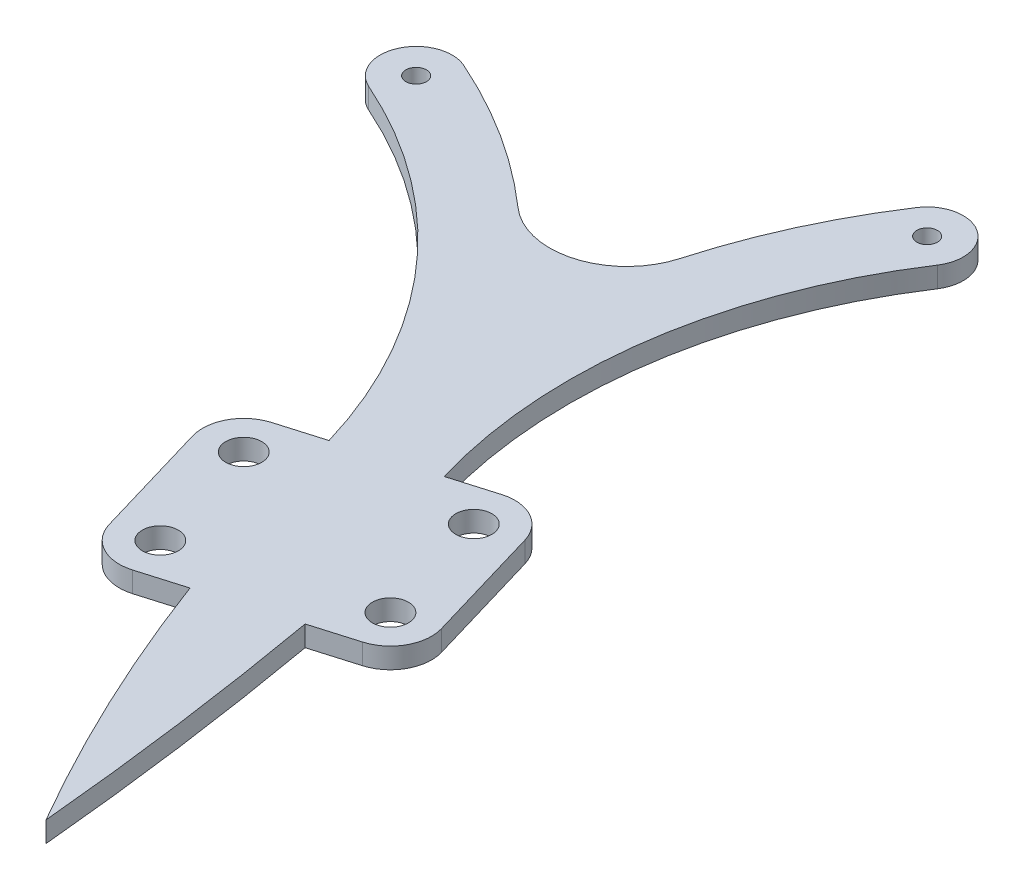
ISO-10303-21;
HEADER;
FILE_DESCRIPTION(('STEP AP214'),'2;1');
FILE_NAME('part.step','',(''),(''),'','','');
FILE_SCHEMA(('AUTOMOTIVE_DESIGN { 1 0 10303 214 1 1 1 1 }'));
ENDSEC;
DATA;
#1=APPLICATION_CONTEXT('core data for automotive mechanical design processes');
#2=APPLICATION_PROTOCOL_DEFINITION('international standard','automotive_design',2000,#1);
#3=PRODUCT_CONTEXT('',#1,'mechanical');
#4=PRODUCT('Part','Part','',(#3));
#5=PRODUCT_RELATED_PRODUCT_CATEGORY('part','',(#4));
#6=PRODUCT_DEFINITION_FORMATION('','',#4);
#7=PRODUCT_DEFINITION_CONTEXT('part definition',#1,'design');
#8=PRODUCT_DEFINITION('design','',#6,#7);
#9=PRODUCT_DEFINITION_SHAPE('','',#8);
#10=(LENGTH_UNIT() NAMED_UNIT(*) SI_UNIT(.MILLI.,.METRE.));
#11=(NAMED_UNIT(*) PLANE_ANGLE_UNIT() SI_UNIT($,.RADIAN.));
#12=(NAMED_UNIT(*) SI_UNIT($,.STERADIAN.) SOLID_ANGLE_UNIT());
#13=UNCERTAINTY_MEASURE_WITH_UNIT(LENGTH_MEASURE(1.E-05),#10,'distance_accuracy_value','');
#14=(GEOMETRIC_REPRESENTATION_CONTEXT(3) GLOBAL_UNCERTAINTY_ASSIGNED_CONTEXT((#13)) GLOBAL_UNIT_ASSIGNED_CONTEXT((#10,
#11,#12)) REPRESENTATION_CONTEXT('',''));
#15=CARTESIAN_POINT('',(0.,0.,0.));
#16=DIRECTION('',(0.,0.,1.));
#17=DIRECTION('',(1.,0.,0.));
#18=AXIS2_PLACEMENT_3D('',#15,#16,#17);
#19=CARTESIAN_POINT('',(84.0501917514937,-1.99999999999998,-23.9933912726605));
#20=DIRECTION('',(0.,-1.,0.));
#21=DIRECTION('',(0.,0.,-1.));
#22=AXIS2_PLACEMENT_3D('',#19,#20,#21);
#23=PLANE('',#22);
#24=CARTESIAN_POINT('',(-73.687037195012,-1.99999999999998,-28.2727576932935));
#25=DIRECTION('',(0.,-1.,0.));
#26=DIRECTION('',(0.,0.,-1.));
#27=AXIS2_PLACEMENT_3D('',#24,#25,#26);
#28=CIRCLE('',#27,0.999999999999998);
#29=CARTESIAN_POINT('',(-73.687037195012,-1.99999999999998,-29.2727576932935));
#30=VERTEX_POINT('',#29);
#31=EDGE_CURVE('E391',#30,#30,#28,.T.);
#32=ORIENTED_EDGE('',*,*,#31,.F.);
#33=EDGE_LOOP('',(#32));
#34=FACE_BOUND('',#33,.T.);
#35=CARTESIAN_POINT('',(-85.3543928779336,-1.99999999999998,34.6276476220212));
#36=DIRECTION('',(0.,-1.,0.));
#37=DIRECTION('',(0.,0.,-1.));
#38=AXIS2_PLACEMENT_3D('',#35,#36,#37);
#39=CIRCLE('',#38,1.74999999999911);
#40=CARTESIAN_POINT('',(-85.3543928779336,-1.99999999999998,32.8776476220221));
#41=VERTEX_POINT('',#40);
#42=EDGE_CURVE('E403',#41,#41,#39,.T.);
#43=ORIENTED_EDGE('',*,*,#42,.F.);
#44=EDGE_LOOP('',(#43));
#45=FACE_BOUND('',#44,.T.);
#46=CARTESIAN_POINT('',(-71.495221732293,-1.99999999999998,18.0003008286735));
#47=DIRECTION('',(0.,-1.,0.));
#48=DIRECTION('',(0.,0.,-1.));
#49=AXIS2_PLACEMENT_3D('',#46,#47,#48);
#50=CIRCLE('',#49,1.74999999999935);
#51=CARTESIAN_POINT('',(-71.495221732293,-1.99999999999998,16.2503008286742));
#52=VERTEX_POINT('',#51);
#53=EDGE_CURVE('E200',#52,#52,#50,.T.);
#54=ORIENTED_EDGE('',*,*,#53,.F.);
#55=EDGE_LOOP('',(#54));
#56=FACE_BOUND('',#55,.T.);
#57=CARTESIAN_POINT('',(84.0501917514937,-1.99999999999998,-23.9933912726605));
#58=DIRECTION('',(0.,-1.,0.));
#59=DIRECTION('',(0.,0.,-1.));
#60=AXIS2_PLACEMENT_3D('',#57,#58,#59);
#61=CIRCLE('',#60,174.999999999999);
#62=CARTESIAN_POINT('',(-67.3820401834826,-1.99999999999998,63.7179485369166));
#63=VERTEX_POINT('',#62);
#64=CARTESIAN_POINT('',(-79.9059632292725,-1.99999999999998,37.1897701683991));
#65=VERTEX_POINT('',#64);
#66=EDGE_CURVE('E233',#63,#65,#61,.T.);
#67=ORIENTED_EDGE('',*,*,#66,.T.);
#68=DIRECTION('',(-0.959075144214479,0.,0.283151669163323));
#69=VECTOR('',#68,1.);
#70=CARTESIAN_POINT('',(-84.2217862012803,-1.99999999999998,38.463948198879));
#71=LINE('',#70,#69);
#72=CARTESIAN_POINT('',(-84.2217862012803,-1.99999999999998,38.463948198879));
#73=VERTEX_POINT('',#72);
#74=EDGE_CURVE('E126',#65,#73,#71,.T.);
#75=ORIENTED_EDGE('',*,*,#74,.T.);
#76=CARTESIAN_POINT('',(-85.3543928779336,-1.99999999999998,34.6276476220212));
#77=DIRECTION('',(0.,-1.,0.));
#78=DIRECTION('',(0.,0.,-1.));
#79=AXIS2_PLACEMENT_3D('',#76,#77,#78);
#80=CIRCLE('',#79,3.99999999999989);
#81=CARTESIAN_POINT('',(-89.1906934547914,-1.99999999999998,35.7602542986745));
#82=VERTEX_POINT('',#81);
#83=EDGE_CURVE('E281',#73,#82,#80,.T.);
#84=ORIENTED_EDGE('',*,*,#83,.T.);
#85=DIRECTION('',(-0.283151669163323,0.,-0.959075144214479));
#86=VECTOR('',#85,1.);
#87=CARTESIAN_POINT('',(-92.5885134847512,-1.99999999999998,24.2513525681007));
#88=LINE('',#87,#86);
#89=CARTESIAN_POINT('',(-92.5885134847512,-1.99999999999998,24.2513525681007));
#90=VERTEX_POINT('',#89);
#91=EDGE_CURVE('E300',#82,#90,#88,.T.);
#92=ORIENTED_EDGE('',*,*,#91,.T.);
#93=CARTESIAN_POINT('',(-88.7522129078933,-1.99999999999998,23.1187458914474));
#94=DIRECTION('',(0.,-1.,0.));
#95=DIRECTION('',(0.,0.,-1.));
#96=AXIS2_PLACEMENT_3D('',#93,#94,#95);
#97=CIRCLE('',#96,3.99999999999999);
#98=CARTESIAN_POINT('',(-89.8848195845466,-1.99999999999998,19.2824453145895));
#99=VERTEX_POINT('',#98);
#100=EDGE_CURVE('E297',#90,#99,#97,.T.);
#101=ORIENTED_EDGE('',*,*,#100,.T.);
#102=DIRECTION('',(0.959075144214479,0.,-0.283151669163323));
#103=VECTOR('',#102,1.);
#104=CARTESIAN_POINT('',(-89.8848195845466,-1.99999999999998,19.2824453145895));
#105=LINE('',#104,#103);
#106=CARTESIAN_POINT('',(-85.5689966125389,-1.99999999999998,18.0082672841097));
#107=VERTEX_POINT('',#106);
#108=EDGE_CURVE('E299',#99,#107,#105,.T.);
#109=ORIENTED_EDGE('',*,*,#108,.T.);
#110=CARTESIAN_POINT('',(-133.797407264091,-1.99999999999998,32.2469377985729));
#111=DIRECTION('',(0.,1.,0.));
#112=DIRECTION('',(0.,0.,-1.));
#113=AXIS2_PLACEMENT_3D('',#110,#111,#112);
#114=CIRCLE('',#113,50.2863732237097);
#115=CARTESIAN_POINT('',(-113.46523465042,-1.99999999999998,-13.7456930111787));
#116=VERTEX_POINT('',#115);
#117=EDGE_CURVE('E302',#107,#116,#114,.T.);
#118=ORIENTED_EDGE('',*,*,#117,.T.);
#119=CARTESIAN_POINT('',(-112.050087770941,-1.99999999999998,-16.9468426967605));
#120=DIRECTION('',(0.,-1.,0.));
#121=DIRECTION('',(0.,0.,-1.));
#122=AXIS2_PLACEMENT_3D('',#119,#120,#121);
#123=CIRCLE('',#122,3.50000000000001);
#124=CARTESIAN_POINT('',(-110.634940891462,-1.99999999999998,-20.1479923823424));
#125=VERTEX_POINT('',#124);
#126=EDGE_CURVE('E308',#116,#125,#123,.T.);
#127=ORIENTED_EDGE('',*,*,#126,.T.);
#128=CARTESIAN_POINT('',(-133.797407264091,-1.99999999999998,32.2469377985729));
#129=DIRECTION('',(0.,-1.,0.));
#130=DIRECTION('',(0.,0.,-1.));
#131=AXIS2_PLACEMENT_3D('',#128,#129,#130);
#132=CIRCLE('',#131,57.2863732237097);
#133=CARTESIAN_POINT('',(-95.9967959370658,-1.99999999999998,-10.7977173914656));
#134=VERTEX_POINT('',#133);
#135=EDGE_CURVE('E310',#125,#134,#132,.T.);
#136=ORIENTED_EDGE('',*,*,#135,.T.);
#137=CARTESIAN_POINT('',(-91.047895020516,-1.99999999999998,-16.4331747569462));
#138=DIRECTION('',(0.,1.,0.));
#139=DIRECTION('',(0.,0.,-1.));
#140=AXIS2_PLACEMENT_3D('',#137,#138,#139);
#141=CIRCLE('',#140,7.49999999999849);
#142=CARTESIAN_POINT('',(-83.8319265586582,-1.99999999999998,-14.388719045161));
#143=VERTEX_POINT('',#142);
#144=EDGE_CURVE('E312',#134,#143,#141,.T.);
#145=ORIENTED_EDGE('',*,*,#144,.T.);
#146=CARTESIAN_POINT('',(-28.7626935602587,-1.99999999999998,1.21370612372912));
#147=DIRECTION('',(0.,-1.,0.));
#148=DIRECTION('',(0.,0.,-1.));
#149=AXIS2_PLACEMENT_3D('',#146,#147,#148);
#150=CIRCLE('',#149,57.2368421052632);
#151=CARTESIAN_POINT('',(-76.6130595767075,-1.99999999999998,-30.1932766392602));
#152=VERTEX_POINT('',#151);
#153=EDGE_CURVE('E314',#143,#152,#150,.T.);
#154=ORIENTED_EDGE('',*,*,#153,.T.);
#155=CARTESIAN_POINT('',(-73.687037195012,-1.99999999999998,-28.2727576932935));
#156=DIRECTION('',(0.,-1.,0.));
#157=DIRECTION('',(0.,0.,-1.));
#158=AXIS2_PLACEMENT_3D('',#155,#156,#157);
#159=CIRCLE('',#158,3.50000000000001);
#160=CARTESIAN_POINT('',(-70.7610148133165,-1.99999999999998,-26.3522387473268));
#161=VERTEX_POINT('',#160);
#162=EDGE_CURVE('E316',#152,#161,#159,.T.);
#163=ORIENTED_EDGE('',*,*,#162,.T.);
#164=CARTESIAN_POINT('',(-28.7626935602587,-1.99999999999998,1.21370612372912));
#165=DIRECTION('',(0.,1.,0.));
#166=DIRECTION('',(0.,0.,-1.));
#167=AXIS2_PLACEMENT_3D('',#164,#165,#166);
#168=CIRCLE('',#167,50.2368421052632);
#169=CARTESIAN_POINT('',(-76.9436564217383,-1.99999999999998,15.4381612081906));
#170=VERTEX_POINT('',#169);
#171=EDGE_CURVE('E318',#161,#170,#168,.T.);
#172=ORIENTED_EDGE('',*,*,#171,.T.);
#173=DIRECTION('',(0.959076264398232,0.,-0.283147874913324));
#174=VECTOR('',#173,1.);
#175=CARTESIAN_POINT('',(-72.6278132319459,-1.99999999999998,14.1639957710805));
#176=LINE('',#175,#174);
#177=CARTESIAN_POINT('',(-72.6278132319459,-1.99999999999998,14.1639957710805));
#178=VERTEX_POINT('',#177);
#179=EDGE_CURVE('E320',#170,#178,#176,.T.);
#180=ORIENTED_EDGE('',*,*,#179,.T.);
#181=CARTESIAN_POINT('',(-71.495221732293,-1.99999999999998,18.0003008286735));
#182=DIRECTION('',(0.,-1.,0.));
#183=DIRECTION('',(0.,0.,-1.));
#184=AXIS2_PLACEMENT_3D('',#181,#182,#183);
#185=CIRCLE('',#184,4.);
#186=CARTESIAN_POINT('',(-67.6589166747001,-1.99999999999998,16.8677093290202));
#187=VERTEX_POINT('',#186);
#188=EDGE_CURVE('E322',#178,#187,#185,.T.);
#189=ORIENTED_EDGE('',*,*,#188,.T.);
#190=DIRECTION('',(0.283147874913323,0.,0.959076264398233));
#191=VECTOR('',#190,1.);
#192=CARTESIAN_POINT('',(-64.2611421757402,-1.99999999999998,28.376624501799));
#193=LINE('',#192,#191);
#194=CARTESIAN_POINT('',(-64.2611421757401,-1.99999999999998,28.376624501799));
#195=VERTEX_POINT('',#194);
#196=EDGE_CURVE('E178',#187,#195,#193,.T.);
#197=ORIENTED_EDGE('',*,*,#196,.T.);
#198=CARTESIAN_POINT('',(-68.0974472333331,-1.99999999999998,29.5092160014523));
#199=DIRECTION('',(0.,-1.,0.));
#200=DIRECTION('',(0.,0.,-1.));
#201=AXIS2_PLACEMENT_3D('',#198,#199,#200);
#202=CIRCLE('',#201,4.00000000000002);
#203=CARTESIAN_POINT('',(-66.9648557336798,-1.99999999999998,33.3455210590453));
#204=VERTEX_POINT('',#203);
#205=EDGE_CURVE('E172',#195,#204,#202,.T.);
#206=ORIENTED_EDGE('',*,*,#205,.T.);
#207=DIRECTION('',(-0.959076264398232,0.,0.283147874913326));
#208=VECTOR('',#207,1.);
#209=CARTESIAN_POINT('',(-71.2806989234718,-1.99999999999998,34.6196864961552));
#210=LINE('',#209,#208);
#211=CARTESIAN_POINT('',(-71.2806989234717,-1.99999999999998,34.6196864961552));
#212=VERTEX_POINT('',#211);
#213=EDGE_CURVE('E176',#204,#212,#210,.T.);
#214=ORIENTED_EDGE('',*,*,#213,.T.);
#215=CARTESIAN_POINT('',(-415.926328807404,-1.99999999999998,95.606486722987));
#216=DIRECTION('',(0.,-1.,0.));
#217=DIRECTION('',(0.,0.,-1.));
#218=AXIS2_PLACEMENT_3D('',#215,#216,#217);
#219=CIRCLE('',#218,350.);
#220=EDGE_CURVE('E50',#212,#63,#219,.T.);
#221=ORIENTED_EDGE('',*,*,#220,.T.);
#222=EDGE_LOOP('',(#67,#75,#84,#92,#101,#109,#118,#127,#136,#145,#154,#163,#172,#180,#189,#197,
#206,#214,#221));
#223=FACE_BOUND('',#222,.T.);
#224=CARTESIAN_POINT('',(-68.0974472333331,-1.99999999999998,29.5092160014523));
#225=DIRECTION('',(0.,-1.,0.));
#226=DIRECTION('',(0.,0.,-1.));
#227=AXIS2_PLACEMENT_3D('',#224,#225,#226);
#228=CIRCLE('',#227,1.74999999999928);
#229=CARTESIAN_POINT('',(-68.0974472333331,-1.99999999999998,27.759216001453));
#230=VERTEX_POINT('',#229);
#231=EDGE_CURVE('E409',#230,#230,#228,.T.);
#232=ORIENTED_EDGE('',*,*,#231,.F.);
#233=EDGE_LOOP('',(#232));
#234=FACE_BOUND('',#233,.T.);
#235=CARTESIAN_POINT('',(-88.7522129078933,-1.99999999999998,23.1187458914474));
#236=DIRECTION('',(0.,-1.,0.));
#237=DIRECTION('',(0.,0.,-1.));
#238=AXIS2_PLACEMENT_3D('',#235,#236,#237);
#239=CIRCLE('',#238,1.74999999999804);
#240=CARTESIAN_POINT('',(-88.7522129078933,-1.99999999999998,21.3687458914494));
#241=VERTEX_POINT('',#240);
#242=EDGE_CURVE('E397',#241,#241,#239,.T.);
#243=ORIENTED_EDGE('',*,*,#242,.F.);
#244=EDGE_LOOP('',(#243));
#245=FACE_BOUND('',#244,.T.);
#246=CARTESIAN_POINT('',(-112.050087770941,-1.99999999999998,-16.9468426967605));
#247=DIRECTION('',(0.,-1.,0.));
#248=DIRECTION('',(0.,0.,-1.));
#249=AXIS2_PLACEMENT_3D('',#246,#247,#248);
#250=CIRCLE('',#249,0.999999999999998);
#251=CARTESIAN_POINT('',(-112.050087770941,-1.99999999999998,-17.9468426967605));
#252=VERTEX_POINT('',#251);
#253=EDGE_CURVE('E382',#252,#252,#250,.T.);
#254=ORIENTED_EDGE('',*,*,#253,.F.);
#255=EDGE_LOOP('',(#254));
#256=FACE_BOUND('',#255,.T.);
#257=ADVANCED_FACE('F33',(#34,#45,#56,#223,#234,#245,#256),#23,.T.);
#258=CARTESIAN_POINT('',(84.0501917514937,0.,-23.9933912726605));
#259=DIRECTION('',(0.,-1.,0.));
#260=DIRECTION('',(0.,0.,-1.));
#261=AXIS2_PLACEMENT_3D('',#258,#259,#260);
#262=PLANE('',#261);
#263=CARTESIAN_POINT('',(-73.687037195012,0.,-28.2727576932935));
#264=DIRECTION('',(0.,-1.,0.));
#265=DIRECTION('',(0.,0.,-1.));
#266=AXIS2_PLACEMENT_3D('',#263,#264,#265);
#267=CIRCLE('',#266,0.999999999999998);
#268=CARTESIAN_POINT('',(-73.687037195012,0.,-29.2727576932935));
#269=VERTEX_POINT('',#268);
#270=EDGE_CURVE('E388',#269,#269,#267,.T.);
#271=ORIENTED_EDGE('',*,*,#270,.T.);
#272=EDGE_LOOP('',(#271));
#273=FACE_BOUND('',#272,.T.);
#274=CARTESIAN_POINT('',(-85.3543928779336,0.,34.6276476220212));
#275=DIRECTION('',(0.,-1.,0.));
#276=DIRECTION('',(0.,0.,-1.));
#277=AXIS2_PLACEMENT_3D('',#274,#275,#276);
#278=CIRCLE('',#277,1.74999999999911);
#279=CARTESIAN_POINT('',(-85.3543928779336,0.,32.8776476220221));
#280=VERTEX_POINT('',#279);
#281=EDGE_CURVE('E400',#280,#280,#278,.T.);
#282=ORIENTED_EDGE('',*,*,#281,.T.);
#283=EDGE_LOOP('',(#282));
#284=FACE_BOUND('',#283,.T.);
#285=CARTESIAN_POINT('',(-71.495221732293,0.,18.0003008286735));
#286=DIRECTION('',(0.,-1.,0.));
#287=DIRECTION('',(0.,0.,-1.));
#288=AXIS2_PLACEMENT_3D('',#285,#286,#287);
#289=CIRCLE('',#288,1.74999999999935);
#290=CARTESIAN_POINT('',(-71.495221732293,0.,16.2503008286742));
#291=VERTEX_POINT('',#290);
#292=EDGE_CURVE('E412',#291,#291,#289,.T.);
#293=ORIENTED_EDGE('',*,*,#292,.T.);
#294=EDGE_LOOP('',(#293));
#295=FACE_BOUND('',#294,.T.);
#296=CARTESIAN_POINT('',(84.0501917514937,0.,-23.9933912726605));
#297=DIRECTION('',(0.,-1.,0.));
#298=DIRECTION('',(0.,0.,-1.));
#299=AXIS2_PLACEMENT_3D('',#296,#297,#298);
#300=CIRCLE('',#299,174.999999999999);
#301=CARTESIAN_POINT('',(-67.3820401834826,0.,63.7179485369166));
#302=VERTEX_POINT('',#301);
#303=CARTESIAN_POINT('',(-79.9059632292725,0.,37.1897701683991));
#304=VERTEX_POINT('',#303);
#305=EDGE_CURVE('E196',#302,#304,#300,.T.);
#306=ORIENTED_EDGE('',*,*,#305,.F.);
#307=CARTESIAN_POINT('',(-415.926328807404,0.,95.606486722987));
#308=DIRECTION('',(0.,-1.,0.));
#309=DIRECTION('',(0.,0.,-1.));
#310=AXIS2_PLACEMENT_3D('',#307,#308,#309);
#311=CIRCLE('',#310,350.);
#312=CARTESIAN_POINT('',(-71.2806989234717,0.,34.6196864961552));
#313=VERTEX_POINT('',#312);
#314=EDGE_CURVE('E118',#313,#302,#311,.T.);
#315=ORIENTED_EDGE('',*,*,#314,.F.);
#316=DIRECTION('',(-0.959076264398232,0.,0.283147874913326));
#317=VECTOR('',#316,1.);
#318=CARTESIAN_POINT('',(-71.2806989234718,0.,34.6196864961552));
#319=LINE('',#318,#317);
#320=CARTESIAN_POINT('',(-66.9648557336798,0.,33.3455210590453));
#321=VERTEX_POINT('',#320);
#322=EDGE_CURVE('E112',#321,#313,#319,.T.);
#323=ORIENTED_EDGE('',*,*,#322,.F.);
#324=CARTESIAN_POINT('',(-68.0974472333331,0.,29.5092160014523));
#325=DIRECTION('',(0.,-1.,0.));
#326=DIRECTION('',(0.,0.,-1.));
#327=AXIS2_PLACEMENT_3D('',#324,#325,#326);
#328=CIRCLE('',#327,4.00000000000002);
#329=CARTESIAN_POINT('',(-64.2611421757401,0.,28.376624501799));
#330=VERTEX_POINT('',#329);
#331=EDGE_CURVE('E186',#330,#321,#328,.T.);
#332=ORIENTED_EDGE('',*,*,#331,.F.);
#333=DIRECTION('',(0.283147874913323,0.,0.959076264398233));
#334=VECTOR('',#333,1.);
#335=CARTESIAN_POINT('',(-64.2611421757402,0.,28.376624501799));
#336=LINE('',#335,#334);
#337=CARTESIAN_POINT('',(-67.6589166747001,0.,16.8677093290202));
#338=VERTEX_POINT('',#337);
#339=EDGE_CURVE('E228',#338,#330,#336,.T.);
#340=ORIENTED_EDGE('',*,*,#339,.F.);
#341=CARTESIAN_POINT('',(-71.495221732293,0.,18.0003008286735));
#342=DIRECTION('',(0.,-1.,0.));
#343=DIRECTION('',(0.,0.,-1.));
#344=AXIS2_PLACEMENT_3D('',#341,#342,#343);
#345=CIRCLE('',#344,4.);
#346=CARTESIAN_POINT('',(-72.6278132319459,0.,14.1639957710805));
#347=VERTEX_POINT('',#346);
#348=EDGE_CURVE('E226',#347,#338,#345,.T.);
#349=ORIENTED_EDGE('',*,*,#348,.F.);
#350=DIRECTION('',(0.959076264398232,0.,-0.283147874913324));
#351=VECTOR('',#350,1.);
#352=CARTESIAN_POINT('',(-72.6278132319459,0.,14.1639957710805));
#353=LINE('',#352,#351);
#354=CARTESIAN_POINT('',(-76.9436564217383,0.,15.4381612081906));
#355=VERTEX_POINT('',#354);
#356=EDGE_CURVE('E224',#355,#347,#353,.T.);
#357=ORIENTED_EDGE('',*,*,#356,.F.);
#358=CARTESIAN_POINT('',(-28.7626935602587,0.,1.21370612372912));
#359=DIRECTION('',(0.,1.,0.));
#360=DIRECTION('',(0.,0.,-1.));
#361=AXIS2_PLACEMENT_3D('',#358,#359,#360);
#362=CIRCLE('',#361,50.2368421052632);
#363=CARTESIAN_POINT('',(-70.7610148133165,0.,-26.3522387473268));
#364=VERTEX_POINT('',#363);
#365=EDGE_CURVE('E222',#364,#355,#362,.T.);
#366=ORIENTED_EDGE('',*,*,#365,.F.);
#367=CARTESIAN_POINT('',(-73.687037195012,0.,-28.2727576932935));
#368=DIRECTION('',(0.,-1.,0.));
#369=DIRECTION('',(0.,0.,-1.));
#370=AXIS2_PLACEMENT_3D('',#367,#368,#369);
#371=CIRCLE('',#370,3.50000000000001);
#372=CARTESIAN_POINT('',(-76.6130595767075,0.,-30.1932766392602));
#373=VERTEX_POINT('',#372);
#374=EDGE_CURVE('E220',#373,#364,#371,.T.);
#375=ORIENTED_EDGE('',*,*,#374,.F.);
#376=CARTESIAN_POINT('',(-28.7626935602587,0.,1.21370612372912));
#377=DIRECTION('',(0.,-1.,0.));
#378=DIRECTION('',(0.,0.,-1.));
#379=AXIS2_PLACEMENT_3D('',#376,#377,#378);
#380=CIRCLE('',#379,57.2368421052632);
#381=CARTESIAN_POINT('',(-83.8319265586582,0.,-14.388719045161));
#382=VERTEX_POINT('',#381);
#383=EDGE_CURVE('E218',#382,#373,#380,.T.);
#384=ORIENTED_EDGE('',*,*,#383,.F.);
#385=CARTESIAN_POINT('',(-91.047895020516,0.,-16.4331747569462));
#386=DIRECTION('',(0.,1.,0.));
#387=DIRECTION('',(0.,0.,-1.));
#388=AXIS2_PLACEMENT_3D('',#385,#386,#387);
#389=CIRCLE('',#388,7.49999999999849);
#390=CARTESIAN_POINT('',(-95.9967959370658,0.,-10.7977173914656));
#391=VERTEX_POINT('',#390);
#392=EDGE_CURVE('E216',#391,#382,#389,.T.);
#393=ORIENTED_EDGE('',*,*,#392,.F.);
#394=CARTESIAN_POINT('',(-133.797407264091,0.,32.2469377985729));
#395=DIRECTION('',(0.,-1.,0.));
#396=DIRECTION('',(0.,0.,-1.));
#397=AXIS2_PLACEMENT_3D('',#394,#395,#396);
#398=CIRCLE('',#397,57.2863732237097);
#399=CARTESIAN_POINT('',(-110.634940891462,0.,-20.1479923823424));
#400=VERTEX_POINT('',#399);
#401=EDGE_CURVE('E214',#400,#391,#398,.T.);
#402=ORIENTED_EDGE('',*,*,#401,.F.);
#403=CARTESIAN_POINT('',(-112.050087770941,0.,-16.9468426967605));
#404=DIRECTION('',(0.,-1.,0.));
#405=DIRECTION('',(0.,0.,-1.));
#406=AXIS2_PLACEMENT_3D('',#403,#404,#405);
#407=CIRCLE('',#406,3.50000000000001);
#408=CARTESIAN_POINT('',(-113.46523465042,0.,-13.7456930111787));
#409=VERTEX_POINT('',#408);
#410=EDGE_CURVE('E212',#409,#400,#407,.T.);
#411=ORIENTED_EDGE('',*,*,#410,.F.);
#412=CARTESIAN_POINT('',(-133.797407264091,0.,32.2469377985729));
#413=DIRECTION('',(0.,1.,0.));
#414=DIRECTION('',(0.,0.,-1.));
#415=AXIS2_PLACEMENT_3D('',#412,#413,#414);
#416=CIRCLE('',#415,50.2863732237097);
#417=CARTESIAN_POINT('',(-85.5689966125389,0.,18.0082672841097));
#418=VERTEX_POINT('',#417);
#419=EDGE_CURVE('E210',#418,#409,#416,.T.);
#420=ORIENTED_EDGE('',*,*,#419,.F.);
#421=DIRECTION('',(0.959075144214479,0.,-0.283151669163323));
#422=VECTOR('',#421,1.);
#423=CARTESIAN_POINT('',(-89.8848195845466,0.,19.2824453145895));
#424=LINE('',#423,#422);
#425=CARTESIAN_POINT('',(-89.8848195845466,0.,19.2824453145895));
#426=VERTEX_POINT('',#425);
#427=EDGE_CURVE('E208',#426,#418,#424,.T.);
#428=ORIENTED_EDGE('',*,*,#427,.F.);
#429=CARTESIAN_POINT('',(-88.7522129078933,0.,23.1187458914474));
#430=DIRECTION('',(0.,-1.,0.));
#431=DIRECTION('',(0.,0.,-1.));
#432=AXIS2_PLACEMENT_3D('',#429,#430,#431);
#433=CIRCLE('',#432,3.99999999999999);
#434=CARTESIAN_POINT('',(-92.5885134847512,0.,24.2513525681007));
#435=VERTEX_POINT('',#434);
#436=EDGE_CURVE('E206',#435,#426,#433,.T.);
#437=ORIENTED_EDGE('',*,*,#436,.F.);
#438=DIRECTION('',(-0.283151669163323,0.,-0.959075144214479));
#439=VECTOR('',#438,1.);
#440=CARTESIAN_POINT('',(-92.5885134847512,0.,24.2513525681007));
#441=LINE('',#440,#439);
#442=CARTESIAN_POINT('',(-89.1906934547914,0.,35.7602542986745));
#443=VERTEX_POINT('',#442);
#444=EDGE_CURVE('E204',#443,#435,#441,.T.);
#445=ORIENTED_EDGE('',*,*,#444,.F.);
#446=CARTESIAN_POINT('',(-85.3543928779336,0.,34.6276476220212));
#447=DIRECTION('',(0.,-1.,0.));
#448=DIRECTION('',(0.,0.,-1.));
#449=AXIS2_PLACEMENT_3D('',#446,#447,#448);
#450=CIRCLE('',#449,3.99999999999989);
#451=CARTESIAN_POINT('',(-84.2217862012803,0.,38.463948198879));
#452=VERTEX_POINT('',#451);
#453=EDGE_CURVE('E202',#452,#443,#450,.T.);
#454=ORIENTED_EDGE('',*,*,#453,.F.);
#455=DIRECTION('',(-0.959075144214479,0.,0.283151669163323));
#456=VECTOR('',#455,1.);
#457=CARTESIAN_POINT('',(-84.2217862012803,0.,38.463948198879));
#458=LINE('',#457,#456);
#459=EDGE_CURVE('E199',#304,#452,#458,.T.);
#460=ORIENTED_EDGE('',*,*,#459,.F.);
#461=EDGE_LOOP('',(#306,#315,#323,#332,#340,#349,#357,#366,#375,#384,#393,#402,#411,#420,#428,
#437,#445,#454,#460));
#462=FACE_BOUND('',#461,.T.);
#463=CARTESIAN_POINT('',(-68.0974472333331,0.,29.5092160014523));
#464=DIRECTION('',(0.,-1.,0.));
#465=DIRECTION('',(0.,0.,-1.));
#466=AXIS2_PLACEMENT_3D('',#463,#464,#465);
#467=CIRCLE('',#466,1.74999999999928);
#468=CARTESIAN_POINT('',(-68.0974472333331,0.,27.759216001453));
#469=VERTEX_POINT('',#468);
#470=EDGE_CURVE('E406',#469,#469,#467,.T.);
#471=ORIENTED_EDGE('',*,*,#470,.T.);
#472=EDGE_LOOP('',(#471));
#473=FACE_BOUND('',#472,.T.);
#474=CARTESIAN_POINT('',(-88.7522129078933,0.,23.1187458914474));
#475=DIRECTION('',(0.,-1.,0.));
#476=DIRECTION('',(0.,0.,-1.));
#477=AXIS2_PLACEMENT_3D('',#474,#475,#476);
#478=CIRCLE('',#477,1.74999999999804);
#479=CARTESIAN_POINT('',(-88.7522129078933,0.,21.3687458914494));
#480=VERTEX_POINT('',#479);
#481=EDGE_CURVE('E394',#480,#480,#478,.T.);
#482=ORIENTED_EDGE('',*,*,#481,.T.);
#483=EDGE_LOOP('',(#482));
#484=FACE_BOUND('',#483,.T.);
#485=CARTESIAN_POINT('',(-112.050087770941,0.,-16.9468426967605));
#486=DIRECTION('',(0.,-1.,0.));
#487=DIRECTION('',(0.,0.,-1.));
#488=AXIS2_PLACEMENT_3D('',#485,#486,#487);
#489=CIRCLE('',#488,0.999999999999998);
#490=CARTESIAN_POINT('',(-112.050087770941,0.,-17.9468426967605));
#491=VERTEX_POINT('',#490);
#492=EDGE_CURVE('E385',#491,#491,#489,.T.);
#493=ORIENTED_EDGE('',*,*,#492,.T.);
#494=EDGE_LOOP('',(#493));
#495=FACE_BOUND('',#494,.T.);
#496=ADVANCED_FACE('F285',(#273,#284,#295,#462,#473,#484,#495),#262,.F.);
#497=CARTESIAN_POINT('',(84.0501917514937,-1.99999999999998,-23.9933912726605));
#498=DIRECTION('',(0.,1.,0.));
#499=DIRECTION('',(0.,0.,1.));
#500=AXIS2_PLACEMENT_3D('',#497,#498,#499);
#501=CYLINDRICAL_SURFACE('',#500,174.999999999999);
#502=ORIENTED_EDGE('',*,*,#305,.T.);
#503=DIRECTION('',(0.,1.,0.));
#504=VECTOR('',#503,1.);
#505=CARTESIAN_POINT('',(-79.9059632292725,-1.99999999999998,37.1897701683991));
#506=LINE('',#505,#504);
#507=EDGE_CURVE('E11',#65,#304,#506,.T.);
#508=ORIENTED_EDGE('',*,*,#507,.F.);
#509=ORIENTED_EDGE('',*,*,#66,.F.);
#510=DIRECTION('',(0.,1.,0.));
#511=VECTOR('',#510,1.);
#512=CARTESIAN_POINT('',(-67.3820401834826,-1.99999999999998,63.7179485369166));
#513=LINE('',#512,#511);
#514=EDGE_CURVE('E192',#63,#302,#513,.T.);
#515=ORIENTED_EDGE('',*,*,#514,.T.);
#516=EDGE_LOOP('',(#502,#508,#509,#515));
#517=FACE_BOUND('',#516,.T.);
#518=ADVANCED_FACE('F35',(#517),#501,.T.);
#519=CARTESIAN_POINT('',(-84.2217862012803,-1.99999999999998,38.463948198879));
#520=DIRECTION('',(-0.283151669163323,0.,-0.959075144214479));
#521=DIRECTION('',(-0.959075144214479,0.,0.283151669163323));
#522=AXIS2_PLACEMENT_3D('',#519,#520,#521);
#523=PLANE('',#522);
#524=ORIENTED_EDGE('',*,*,#459,.T.);
#525=DIRECTION('',(0.,1.,0.));
#526=VECTOR('',#525,1.);
#527=CARTESIAN_POINT('',(-84.2217862012803,-1.99999999999998,38.463948198879));
#528=LINE('',#527,#526);
#529=EDGE_CURVE('E42',#73,#452,#528,.T.);
#530=ORIENTED_EDGE('',*,*,#529,.F.);
#531=ORIENTED_EDGE('',*,*,#74,.F.);
#532=ORIENTED_EDGE('',*,*,#507,.T.);
#533=EDGE_LOOP('',(#524,#530,#531,#532));
#534=FACE_BOUND('',#533,.T.);
#535=ADVANCED_FACE('F609',(#534),#523,.F.);
#536=CARTESIAN_POINT('',(-85.3543928779336,-1.99999999999998,34.6276476220212));
#537=DIRECTION('',(0.,1.,0.));
#538=DIRECTION('',(0.,0.,1.));
#539=AXIS2_PLACEMENT_3D('',#536,#537,#538);
#540=CYLINDRICAL_SURFACE('',#539,3.99999999999989);
#541=ORIENTED_EDGE('',*,*,#453,.T.);
#542=DIRECTION('',(0.,1.,0.));
#543=VECTOR('',#542,1.);
#544=CARTESIAN_POINT('',(-89.1906934547914,-1.99999999999998,35.7602542986745));
#545=LINE('',#544,#543);
#546=EDGE_CURVE('E273',#82,#443,#545,.T.);
#547=ORIENTED_EDGE('',*,*,#546,.F.);
#548=ORIENTED_EDGE('',*,*,#83,.F.);
#549=ORIENTED_EDGE('',*,*,#529,.T.);
#550=EDGE_LOOP('',(#541,#547,#548,#549));
#551=FACE_BOUND('',#550,.T.);
#552=ADVANCED_FACE('F279',(#551),#540,.T.);
#553=CARTESIAN_POINT('',(-92.5885134847512,-1.99999999999998,24.2513525681007));
#554=DIRECTION('',(0.959075144214479,0.,-0.283151669163323));
#555=DIRECTION('',(-0.283151669163323,0.,-0.959075144214479));
#556=AXIS2_PLACEMENT_3D('',#553,#554,#555);
#557=PLANE('',#556);
#558=ORIENTED_EDGE('',*,*,#444,.T.);
#559=DIRECTION('',(0.,1.,0.));
#560=VECTOR('',#559,1.);
#561=CARTESIAN_POINT('',(-92.5885134847512,-1.99999999999998,24.2513525681007));
#562=LINE('',#561,#560);
#563=EDGE_CURVE('E270',#90,#435,#562,.T.);
#564=ORIENTED_EDGE('',*,*,#563,.F.);
#565=ORIENTED_EDGE('',*,*,#91,.F.);
#566=ORIENTED_EDGE('',*,*,#546,.T.);
#567=EDGE_LOOP('',(#558,#564,#565,#566));
#568=FACE_BOUND('',#567,.T.);
#569=ADVANCED_FACE('F291',(#568),#557,.F.);
#570=CARTESIAN_POINT('',(-88.7522129078933,-1.99999999999998,23.1187458914474));
#571=DIRECTION('',(0.,1.,0.));
#572=DIRECTION('',(0.,0.,1.));
#573=AXIS2_PLACEMENT_3D('',#570,#571,#572);
#574=CYLINDRICAL_SURFACE('',#573,3.99999999999999);
#575=ORIENTED_EDGE('',*,*,#436,.T.);
#576=DIRECTION('',(0.,1.,0.));
#577=VECTOR('',#576,1.);
#578=CARTESIAN_POINT('',(-89.8848195845466,-1.99999999999998,19.2824453145895));
#579=LINE('',#578,#577);
#580=EDGE_CURVE('E267',#99,#426,#579,.T.);
#581=ORIENTED_EDGE('',*,*,#580,.F.);
#582=ORIENTED_EDGE('',*,*,#100,.F.);
#583=ORIENTED_EDGE('',*,*,#563,.T.);
#584=EDGE_LOOP('',(#575,#581,#582,#583));
#585=FACE_BOUND('',#584,.T.);
#586=ADVANCED_FACE('F295',(#585),#574,.T.);
#587=CARTESIAN_POINT('',(-89.8848195845466,-1.99999999999998,19.2824453145895));
#588=DIRECTION('',(0.283151669163323,0.,0.959075144214479));
#589=DIRECTION('',(0.959075144214479,0.,-0.283151669163323));
#590=AXIS2_PLACEMENT_3D('',#587,#588,#589);
#591=PLANE('',#590);
#592=ORIENTED_EDGE('',*,*,#427,.T.);
#593=DIRECTION('',(0.,1.,0.));
#594=VECTOR('',#593,1.);
#595=CARTESIAN_POINT('',(-85.5689966125389,-1.99999999999998,18.0082672841097));
#596=LINE('',#595,#594);
#597=EDGE_CURVE('E264',#107,#418,#596,.T.);
#598=ORIENTED_EDGE('',*,*,#597,.F.);
#599=ORIENTED_EDGE('',*,*,#108,.F.);
#600=ORIENTED_EDGE('',*,*,#580,.T.);
#601=EDGE_LOOP('',(#592,#598,#599,#600));
#602=FACE_BOUND('',#601,.T.);
#603=ADVANCED_FACE('F574',(#602),#591,.F.);
#604=CARTESIAN_POINT('',(-133.797407264091,-1.99999999999998,32.2469377985729));
#605=DIRECTION('',(0.,1.,0.));
#606=DIRECTION('',(0.,0.,1.));
#607=AXIS2_PLACEMENT_3D('',#604,#605,#606);
#608=CYLINDRICAL_SURFACE('',#607,50.2863732237097);
#609=ORIENTED_EDGE('',*,*,#419,.T.);
#610=DIRECTION('',(0.,1.,0.));
#611=VECTOR('',#610,1.);
#612=CARTESIAN_POINT('',(-113.46523465042,-1.99999999999998,-13.7456930111787));
#613=LINE('',#612,#611);
#614=EDGE_CURVE('E261',#116,#409,#613,.T.);
#615=ORIENTED_EDGE('',*,*,#614,.F.);
#616=ORIENTED_EDGE('',*,*,#117,.F.);
#617=ORIENTED_EDGE('',*,*,#597,.T.);
#618=EDGE_LOOP('',(#609,#615,#616,#617));
#619=FACE_BOUND('',#618,.T.);
#620=ADVANCED_FACE('F564',(#619),#608,.F.);
#621=CARTESIAN_POINT('',(-112.050087770941,-1.99999999999998,-16.9468426967605));
#622=DIRECTION('',(0.,1.,0.));
#623=DIRECTION('',(0.,0.,1.));
#624=AXIS2_PLACEMENT_3D('',#621,#622,#623);
#625=CYLINDRICAL_SURFACE('',#624,3.50000000000001);
#626=ORIENTED_EDGE('',*,*,#410,.T.);
#627=DIRECTION('',(0.,1.,0.));
#628=VECTOR('',#627,1.);
#629=CARTESIAN_POINT('',(-110.634940891462,-1.99999999999998,-20.1479923823424));
#630=LINE('',#629,#628);
#631=EDGE_CURVE('E258',#125,#400,#630,.T.);
#632=ORIENTED_EDGE('',*,*,#631,.F.);
#633=ORIENTED_EDGE('',*,*,#126,.F.);
#634=ORIENTED_EDGE('',*,*,#614,.T.);
#635=EDGE_LOOP('',(#626,#632,#633,#634));
#636=FACE_BOUND('',#635,.T.);
#637=ADVANCED_FACE('F554',(#636),#625,.T.);
#638=CARTESIAN_POINT('',(-133.797407264091,-1.99999999999998,32.2469377985729));
#639=DIRECTION('',(0.,1.,0.));
#640=DIRECTION('',(0.,0.,1.));
#641=AXIS2_PLACEMENT_3D('',#638,#639,#640);
#642=CYLINDRICAL_SURFACE('',#641,57.2863732237097);
#643=ORIENTED_EDGE('',*,*,#401,.T.);
#644=DIRECTION('',(0.,1.,0.));
#645=VECTOR('',#644,1.);
#646=CARTESIAN_POINT('',(-95.9967959370658,-1.99999999999998,-10.7977173914656));
#647=LINE('',#646,#645);
#648=EDGE_CURVE('E255',#134,#391,#647,.T.);
#649=ORIENTED_EDGE('',*,*,#648,.F.);
#650=ORIENTED_EDGE('',*,*,#135,.F.);
#651=ORIENTED_EDGE('',*,*,#631,.T.);
#652=EDGE_LOOP('',(#643,#649,#650,#651));
#653=FACE_BOUND('',#652,.T.);
#654=ADVANCED_FACE('F544',(#653),#642,.T.);
#655=CARTESIAN_POINT('',(-91.047895020516,-1.99999999999998,-16.4331747569462));
#656=DIRECTION('',(0.,1.,0.));
#657=DIRECTION('',(0.,0.,1.));
#658=AXIS2_PLACEMENT_3D('',#655,#656,#657);
#659=CYLINDRICAL_SURFACE('',#658,7.49999999999849);
#660=ORIENTED_EDGE('',*,*,#392,.T.);
#661=DIRECTION('',(0.,1.,0.));
#662=VECTOR('',#661,1.);
#663=CARTESIAN_POINT('',(-83.8319265586582,-1.99999999999998,-14.388719045161));
#664=LINE('',#663,#662);
#665=EDGE_CURVE('E252',#143,#382,#664,.T.);
#666=ORIENTED_EDGE('',*,*,#665,.F.);
#667=ORIENTED_EDGE('',*,*,#144,.F.);
#668=ORIENTED_EDGE('',*,*,#648,.T.);
#669=EDGE_LOOP('',(#660,#666,#667,#668));
#670=FACE_BOUND('',#669,.T.);
#671=ADVANCED_FACE('F534',(#670),#659,.F.);
#672=CARTESIAN_POINT('',(-28.7626935602587,-1.99999999999998,1.21370612372912));
#673=DIRECTION('',(0.,1.,0.));
#674=DIRECTION('',(0.,0.,1.));
#675=AXIS2_PLACEMENT_3D('',#672,#673,#674);
#676=CYLINDRICAL_SURFACE('',#675,57.2368421052632);
#677=ORIENTED_EDGE('',*,*,#383,.T.);
#678=DIRECTION('',(0.,1.,0.));
#679=VECTOR('',#678,1.);
#680=CARTESIAN_POINT('',(-76.6130595767075,-1.99999999999998,-30.1932766392602));
#681=LINE('',#680,#679);
#682=EDGE_CURVE('E249',#152,#373,#681,.T.);
#683=ORIENTED_EDGE('',*,*,#682,.F.);
#684=ORIENTED_EDGE('',*,*,#153,.F.);
#685=ORIENTED_EDGE('',*,*,#665,.T.);
#686=EDGE_LOOP('',(#677,#683,#684,#685));
#687=FACE_BOUND('',#686,.T.);
#688=ADVANCED_FACE('F524',(#687),#676,.T.);
#689=CARTESIAN_POINT('',(-73.687037195012,-1.99999999999998,-28.2727576932935));
#690=DIRECTION('',(0.,1.,0.));
#691=DIRECTION('',(0.,0.,1.));
#692=AXIS2_PLACEMENT_3D('',#689,#690,#691);
#693=CYLINDRICAL_SURFACE('',#692,3.50000000000001);
#694=ORIENTED_EDGE('',*,*,#374,.T.);
#695=DIRECTION('',(0.,1.,0.));
#696=VECTOR('',#695,1.);
#697=CARTESIAN_POINT('',(-70.7610148133165,-1.99999999999998,-26.3522387473268));
#698=LINE('',#697,#696);
#699=EDGE_CURVE('E246',#161,#364,#698,.T.);
#700=ORIENTED_EDGE('',*,*,#699,.F.);
#701=ORIENTED_EDGE('',*,*,#162,.F.);
#702=ORIENTED_EDGE('',*,*,#682,.T.);
#703=EDGE_LOOP('',(#694,#700,#701,#702));
#704=FACE_BOUND('',#703,.T.);
#705=ADVANCED_FACE('F514',(#704),#693,.T.);
#706=CARTESIAN_POINT('',(-28.7626935602587,-1.99999999999998,1.21370612372912));
#707=DIRECTION('',(0.,1.,0.));
#708=DIRECTION('',(0.,0.,1.));
#709=AXIS2_PLACEMENT_3D('',#706,#707,#708);
#710=CYLINDRICAL_SURFACE('',#709,50.2368421052632);
#711=ORIENTED_EDGE('',*,*,#365,.T.);
#712=DIRECTION('',(0.,1.,0.));
#713=VECTOR('',#712,1.);
#714=CARTESIAN_POINT('',(-76.9436564217383,-1.99999999999998,15.4381612081906));
#715=LINE('',#714,#713);
#716=EDGE_CURVE('E243',#170,#355,#715,.T.);
#717=ORIENTED_EDGE('',*,*,#716,.F.);
#718=ORIENTED_EDGE('',*,*,#171,.F.);
#719=ORIENTED_EDGE('',*,*,#699,.T.);
#720=EDGE_LOOP('',(#711,#717,#718,#719));
#721=FACE_BOUND('',#720,.T.);
#722=ADVANCED_FACE('F504',(#721),#710,.F.);
#723=CARTESIAN_POINT('',(-72.6278132319459,-1.99999999999998,14.1639957710805));
#724=DIRECTION('',(0.283147874913324,0.,0.959076264398233));
#725=DIRECTION('',(0.959076264398233,0.,-0.283147874913324));
#726=AXIS2_PLACEMENT_3D('',#723,#724,#725);
#727=PLANE('',#726);
#728=ORIENTED_EDGE('',*,*,#356,.T.);
#729=DIRECTION('',(0.,1.,0.));
#730=VECTOR('',#729,1.);
#731=CARTESIAN_POINT('',(-72.6278132319459,-1.99999999999998,14.1639957710805));
#732=LINE('',#731,#730);
#733=EDGE_CURVE('E240',#178,#347,#732,.T.);
#734=ORIENTED_EDGE('',*,*,#733,.F.);
#735=ORIENTED_EDGE('',*,*,#179,.F.);
#736=ORIENTED_EDGE('',*,*,#716,.T.);
#737=EDGE_LOOP('',(#728,#734,#735,#736));
#738=FACE_BOUND('',#737,.T.);
#739=ADVANCED_FACE('F495',(#738),#727,.F.);
#740=CARTESIAN_POINT('',(-71.495221732293,-1.99999999999998,18.0003008286735));
#741=DIRECTION('',(0.,1.,0.));
#742=DIRECTION('',(0.,0.,1.));
#743=AXIS2_PLACEMENT_3D('',#740,#741,#742);
#744=CYLINDRICAL_SURFACE('',#743,4.);
#745=ORIENTED_EDGE('',*,*,#348,.T.);
#746=DIRECTION('',(0.,1.,0.));
#747=VECTOR('',#746,1.);
#748=CARTESIAN_POINT('',(-67.6589166747001,-1.99999999999998,16.8677093290202));
#749=LINE('',#748,#747);
#750=EDGE_CURVE('E237',#187,#338,#749,.T.);
#751=ORIENTED_EDGE('',*,*,#750,.F.);
#752=ORIENTED_EDGE('',*,*,#188,.F.);
#753=ORIENTED_EDGE('',*,*,#733,.T.);
#754=EDGE_LOOP('',(#745,#751,#752,#753));
#755=FACE_BOUND('',#754,.T.);
#756=ADVANCED_FACE('F328',(#755),#744,.T.);
#757=CARTESIAN_POINT('',(-64.2611421757402,-1.99999999999998,28.376624501799));
#758=DIRECTION('',(-0.959076264398233,0.,0.283147874913323));
#759=DIRECTION('',(0.283147874913323,0.,0.959076264398233));
#760=AXIS2_PLACEMENT_3D('',#757,#758,#759);
#761=PLANE('',#760);
#762=ORIENTED_EDGE('',*,*,#339,.T.);
#763=DIRECTION('',(0.,1.,0.));
#764=VECTOR('',#763,1.);
#765=CARTESIAN_POINT('',(-64.2611421757401,-1.99999999999998,28.376624501799));
#766=LINE('',#765,#764);
#767=EDGE_CURVE('E187',#195,#330,#766,.T.);
#768=ORIENTED_EDGE('',*,*,#767,.F.);
#769=ORIENTED_EDGE('',*,*,#196,.F.);
#770=ORIENTED_EDGE('',*,*,#750,.T.);
#771=EDGE_LOOP('',(#762,#768,#769,#770));
#772=FACE_BOUND('',#771,.T.);
#773=ADVANCED_FACE('F332',(#772),#761,.F.);
#774=CARTESIAN_POINT('',(-68.0974472333331,-1.99999999999998,29.5092160014523));
#775=DIRECTION('',(0.,1.,0.));
#776=DIRECTION('',(0.,0.,1.));
#777=AXIS2_PLACEMENT_3D('',#774,#775,#776);
#778=CYLINDRICAL_SURFACE('',#777,4.00000000000002);
#779=ORIENTED_EDGE('',*,*,#331,.T.);
#780=DIRECTION('',(0.,1.,0.));
#781=VECTOR('',#780,1.);
#782=CARTESIAN_POINT('',(-66.9648557336798,-1.99999999999998,33.3455210590453));
#783=LINE('',#782,#781);
#784=EDGE_CURVE('E183',#204,#321,#783,.T.);
#785=ORIENTED_EDGE('',*,*,#784,.F.);
#786=ORIENTED_EDGE('',*,*,#205,.F.);
#787=ORIENTED_EDGE('',*,*,#767,.T.);
#788=EDGE_LOOP('',(#779,#785,#786,#787));
#789=FACE_BOUND('',#788,.T.);
#790=ADVANCED_FACE('F184',(#789),#778,.T.);
#791=CARTESIAN_POINT('',(-71.2806989234718,-1.99999999999998,34.6196864961552));
#792=DIRECTION('',(-0.283147874913326,0.,-0.959076264398232));
#793=DIRECTION('',(-0.959076264398232,0.,0.283147874913326));
#794=AXIS2_PLACEMENT_3D('',#791,#792,#793);
#795=PLANE('',#794);
#796=ORIENTED_EDGE('',*,*,#322,.T.);
#797=DIRECTION('',(0.,1.,0.));
#798=VECTOR('',#797,1.);
#799=CARTESIAN_POINT('',(-71.2806989234717,-1.99999999999998,34.6196864961552));
#800=LINE('',#799,#798);
#801=EDGE_CURVE('E188',#212,#313,#800,.T.);
#802=ORIENTED_EDGE('',*,*,#801,.F.);
#803=ORIENTED_EDGE('',*,*,#213,.F.);
#804=ORIENTED_EDGE('',*,*,#784,.T.);
#805=EDGE_LOOP('',(#796,#802,#803,#804));
#806=FACE_BOUND('',#805,.T.);
#807=ADVANCED_FACE('F190',(#806),#795,.F.);
#808=CARTESIAN_POINT('',(-415.926328807404,-1.99999999999998,95.606486722987));
#809=DIRECTION('',(0.,1.,0.));
#810=DIRECTION('',(0.,0.,1.));
#811=AXIS2_PLACEMENT_3D('',#808,#809,#810);
#812=CYLINDRICAL_SURFACE('',#811,350.);
#813=ORIENTED_EDGE('',*,*,#314,.T.);
#814=ORIENTED_EDGE('',*,*,#514,.F.);
#815=ORIENTED_EDGE('',*,*,#220,.F.);
#816=ORIENTED_EDGE('',*,*,#801,.T.);
#817=EDGE_LOOP('',(#813,#814,#815,#816));
#818=FACE_BOUND('',#817,.T.);
#819=ADVANCED_FACE('F336',(#818),#812,.T.);
#820=CARTESIAN_POINT('',(-71.495221732293,-1.99999999999998,18.0003008286735));
#821=DIRECTION('',(0.,1.,0.));
#822=DIRECTION('',(0.,0.,1.));
#823=AXIS2_PLACEMENT_3D('',#820,#821,#822);
#824=CYLINDRICAL_SURFACE('',#823,1.74999999999935);
#825=ORIENTED_EDGE('',*,*,#53,.T.);
#826=EDGE_LOOP('',(#825));
#827=FACE_BOUND('',#826,.T.);
#828=ORIENTED_EDGE('',*,*,#292,.F.);
#829=EDGE_LOOP('',(#828));
#830=FACE_BOUND('',#829,.T.);
#831=ADVANCED_FACE('F338',(#827,#830),#824,.F.);
#832=CARTESIAN_POINT('',(-68.0974472333331,-1.99999999999998,29.5092160014523));
#833=DIRECTION('',(0.,1.,0.));
#834=DIRECTION('',(0.,0.,1.));
#835=AXIS2_PLACEMENT_3D('',#832,#833,#834);
#836=CYLINDRICAL_SURFACE('',#835,1.74999999999928);
#837=ORIENTED_EDGE('',*,*,#231,.T.);
#838=EDGE_LOOP('',(#837));
#839=FACE_BOUND('',#838,.T.);
#840=ORIENTED_EDGE('',*,*,#470,.F.);
#841=EDGE_LOOP('',(#840));
#842=FACE_BOUND('',#841,.T.);
#843=ADVANCED_FACE('F344',(#839,#842),#836,.F.);
#844=CARTESIAN_POINT('',(-85.3543928779336,-1.99999999999998,34.6276476220212));
#845=DIRECTION('',(0.,1.,0.));
#846=DIRECTION('',(0.,0.,1.));
#847=AXIS2_PLACEMENT_3D('',#844,#845,#846);
#848=CYLINDRICAL_SURFACE('',#847,1.74999999999911);
#849=ORIENTED_EDGE('',*,*,#42,.T.);
#850=EDGE_LOOP('',(#849));
#851=FACE_BOUND('',#850,.T.);
#852=ORIENTED_EDGE('',*,*,#281,.F.);
#853=EDGE_LOOP('',(#852));
#854=FACE_BOUND('',#853,.T.);
#855=ADVANCED_FACE('F361',(#851,#854),#848,.F.);
#856=CARTESIAN_POINT('',(-88.7522129078933,-1.99999999999998,23.1187458914474));
#857=DIRECTION('',(0.,1.,0.));
#858=DIRECTION('',(0.,0.,1.));
#859=AXIS2_PLACEMENT_3D('',#856,#857,#858);
#860=CYLINDRICAL_SURFACE('',#859,1.74999999999804);
#861=ORIENTED_EDGE('',*,*,#242,.T.);
#862=EDGE_LOOP('',(#861));
#863=FACE_BOUND('',#862,.T.);
#864=ORIENTED_EDGE('',*,*,#481,.F.);
#865=EDGE_LOOP('',(#864));
#866=FACE_BOUND('',#865,.T.);
#867=ADVANCED_FACE('F365',(#863,#866),#860,.F.);
#868=CARTESIAN_POINT('',(-73.687037195012,-1.99999999999998,-28.2727576932935));
#869=DIRECTION('',(0.,1.,0.));
#870=DIRECTION('',(0.,0.,1.));
#871=AXIS2_PLACEMENT_3D('',#868,#869,#870);
#872=CYLINDRICAL_SURFACE('',#871,0.999999999999998);
#873=ORIENTED_EDGE('',*,*,#31,.T.);
#874=EDGE_LOOP('',(#873));
#875=FACE_BOUND('',#874,.T.);
#876=ORIENTED_EDGE('',*,*,#270,.F.);
#877=EDGE_LOOP('',(#876));
#878=FACE_BOUND('',#877,.T.);
#879=ADVANCED_FACE('F369',(#875,#878),#872,.F.);
#880=CARTESIAN_POINT('',(-112.050087770941,-1.99999999999998,-16.9468426967605));
#881=DIRECTION('',(0.,1.,0.));
#882=DIRECTION('',(0.,0.,1.));
#883=AXIS2_PLACEMENT_3D('',#880,#881,#882);
#884=CYLINDRICAL_SURFACE('',#883,0.999999999999998);
#885=ORIENTED_EDGE('',*,*,#253,.T.);
#886=EDGE_LOOP('',(#885));
#887=FACE_BOUND('',#886,.T.);
#888=ORIENTED_EDGE('',*,*,#492,.F.);
#889=EDGE_LOOP('',(#888));
#890=FACE_BOUND('',#889,.T.);
#891=ADVANCED_FACE('F373',(#887,#890),#884,.F.);
#892=CLOSED_SHELL('',(#257,#496,#518,#535,#552,#569,#586,#603,#620,#637,#654,#671,#688,#705,
#722,#739,#756,#773,#790,#807,#819,#831,#843,#855,#867,#879,#891));
#893=MANIFOLD_SOLID_BREP('B2',#892);
#894=ADVANCED_BREP_SHAPE_REPRESENTATION('',(#18,#893),#14);
#895=SHAPE_DEFINITION_REPRESENTATION(#9,#894);
ENDSEC;
END-ISO-10303-21;
